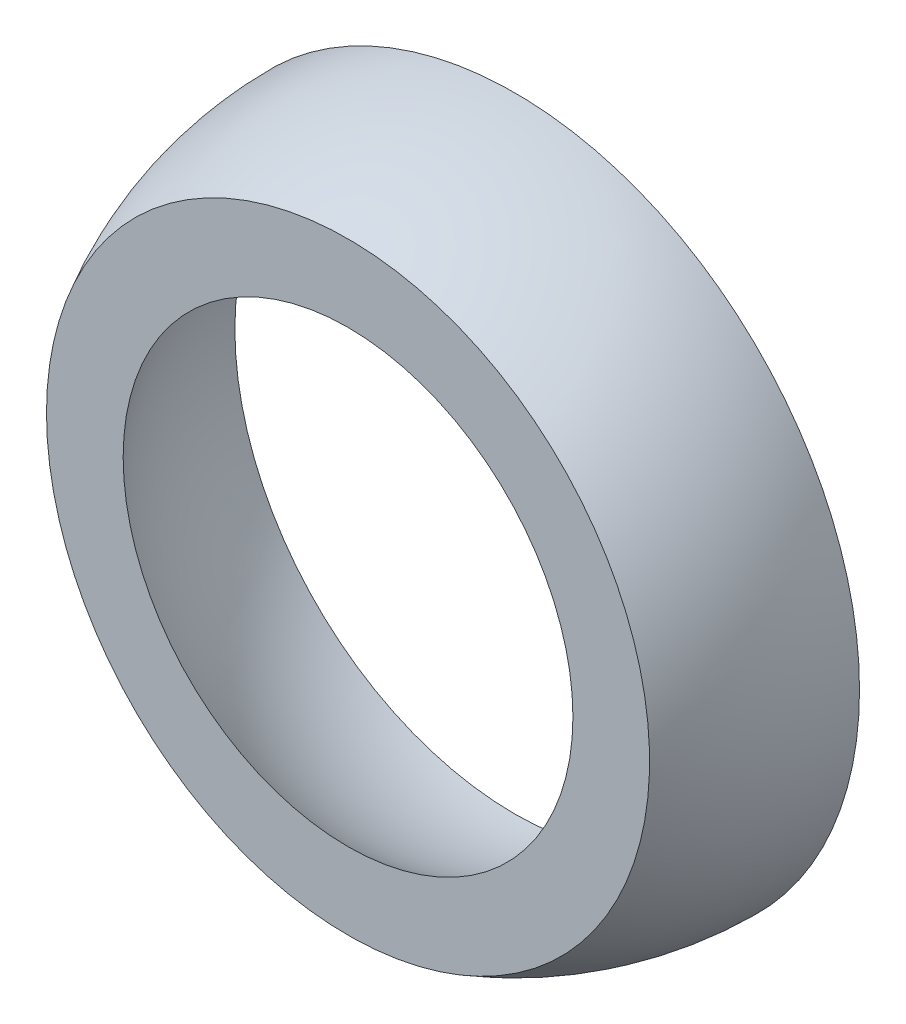
ISO-10303-21;
HEADER;
FILE_DESCRIPTION(('STEP AP214'),'2;1');
FILE_NAME('part.step','',(''),(''),'','','');
FILE_SCHEMA(('AUTOMOTIVE_DESIGN { 1 0 10303 214 1 1 1 1 }'));
ENDSEC;
DATA;
#1=APPLICATION_CONTEXT('core data for automotive mechanical design processes');
#2=APPLICATION_PROTOCOL_DEFINITION('international standard','automotive_design',2000,#1);
#3=PRODUCT_CONTEXT('',#1,'mechanical');
#4=PRODUCT('Part','Part','',(#3));
#5=PRODUCT_RELATED_PRODUCT_CATEGORY('part','',(#4));
#6=PRODUCT_DEFINITION_FORMATION('','',#4);
#7=PRODUCT_DEFINITION_CONTEXT('part definition',#1,'design');
#8=PRODUCT_DEFINITION('design','',#6,#7);
#9=PRODUCT_DEFINITION_SHAPE('','',#8);
#10=(LENGTH_UNIT() NAMED_UNIT(*) SI_UNIT(.MILLI.,.METRE.));
#11=(NAMED_UNIT(*) PLANE_ANGLE_UNIT() SI_UNIT($,.RADIAN.));
#12=(NAMED_UNIT(*) SI_UNIT($,.STERADIAN.) SOLID_ANGLE_UNIT());
#13=UNCERTAINTY_MEASURE_WITH_UNIT(LENGTH_MEASURE(1.E-05),#10,'distance_accuracy_value','');
#14=(GEOMETRIC_REPRESENTATION_CONTEXT(3) GLOBAL_UNCERTAINTY_ASSIGNED_CONTEXT((#13)) GLOBAL_UNIT_ASSIGNED_CONTEXT((#10,
#11,#12)) REPRESENTATION_CONTEXT('',''));
#15=CARTESIAN_POINT('',(0.,0.,0.));
#16=DIRECTION('',(0.,0.,1.));
#17=DIRECTION('',(1.,0.,0.));
#18=AXIS2_PLACEMENT_3D('',#15,#16,#17);
#19=CARTESIAN_POINT('',(0.,0.,0.));
#20=DIRECTION('',(0.,0.,1.));
#21=DIRECTION('',(0.,-1.,0.));
#22=AXIS2_PLACEMENT_3D('',#19,#20,#21);
#23=SPHERICAL_SURFACE('',#22,13.);
#24=CARTESIAN_POINT('',(0.,0.,7.74596669241483));
#25=DIRECTION('',(0.,0.,-1.));
#26=DIRECTION('',(-1.,0.,0.));
#27=AXIS2_PLACEMENT_3D('',#24,#25,#26);
#28=CIRCLE('',#27,10.4403065089106);
#29=CARTESIAN_POINT('',(-10.4403065089106,0.,7.74596669241483));
#30=VERTEX_POINT('',#29);
#31=EDGE_CURVE('E45',#30,#30,#28,.F.);
#32=ORIENTED_EDGE('',*,*,#31,.T.);
#33=EDGE_LOOP('',(#32));
#34=FACE_BOUND('',#33,.T.);
#35=CARTESIAN_POINT('',(0.,0.,0.));
#36=DIRECTION('',(0.,0.,1.));
#37=DIRECTION('',(1.,0.,0.));
#38=AXIS2_PLACEMENT_3D('',#35,#36,#37);
#39=CIRCLE('',#38,13.);
#40=CARTESIAN_POINT('',(13.,0.,0.));
#41=VERTEX_POINT('',#40);
#42=EDGE_CURVE('E37',#41,#41,#39,.T.);
#43=ORIENTED_EDGE('',*,*,#42,.F.);
#44=EDGE_LOOP('',(#43));
#45=FACE_BOUND('',#44,.T.);
#46=ADVANCED_FACE('F31',(#34,#45),#23,.F.);
#47=CARTESIAN_POINT('',(0.,16.,0.));
#48=DIRECTION('',(0.,0.,1.));
#49=DIRECTION('',(1.,0.,0.));
#50=AXIS2_PLACEMENT_3D('',#47,#48,#49);
#51=PLANE('',#50);
#52=CARTESIAN_POINT('',(0.,0.,0.));
#53=DIRECTION('',(0.,0.,1.));
#54=DIRECTION('',(1.,0.,0.));
#55=AXIS2_PLACEMENT_3D('',#52,#53,#54);
#56=CIRCLE('',#55,16.);
#57=CARTESIAN_POINT('',(16.,0.,0.));
#58=VERTEX_POINT('',#57);
#59=EDGE_CURVE('E41',#58,#58,#56,.T.);
#60=ORIENTED_EDGE('',*,*,#59,.F.);
#61=EDGE_LOOP('',(#60));
#62=FACE_BOUND('',#61,.T.);
#63=ORIENTED_EDGE('',*,*,#42,.T.);
#64=EDGE_LOOP('',(#63));
#65=FACE_BOUND('',#64,.T.);
#66=ADVANCED_FACE('F61',(#62,#65),#51,.F.);
#67=CARTESIAN_POINT('',(0.,0.,0.));
#68=DIRECTION('',(0.,0.,1.));
#69=DIRECTION('',(0.,1.,0.));
#70=AXIS2_PLACEMENT_3D('',#67,#68,#69);
#71=SPHERICAL_SURFACE('',#70,16.);
#72=CARTESIAN_POINT('',(0.,0.,7.74596669241483));
#73=DIRECTION('',(0.,0.,-1.));
#74=DIRECTION('',(-1.,0.,0.));
#75=AXIS2_PLACEMENT_3D('',#72,#73,#74);
#76=CIRCLE('',#75,14.);
#77=CARTESIAN_POINT('',(-14.,0.,7.74596669241483));
#78=VERTEX_POINT('',#77);
#79=EDGE_CURVE('E10',#78,#78,#76,.T.);
#80=ORIENTED_EDGE('',*,*,#79,.T.);
#81=EDGE_LOOP('',(#80));
#82=FACE_BOUND('',#81,.T.);
#83=ORIENTED_EDGE('',*,*,#59,.T.);
#84=EDGE_LOOP('',(#83));
#85=FACE_BOUND('',#84,.T.);
#86=ADVANCED_FACE('F55',(#82,#85),#71,.T.);
#87=CARTESIAN_POINT('',(-16.,14.,7.74596669241483));
#88=DIRECTION('',(0.,0.,-1.));
#89=DIRECTION('',(-1.,0.,0.));
#90=AXIS2_PLACEMENT_3D('',#87,#88,#89);
#91=PLANE('',#90);
#92=ORIENTED_EDGE('',*,*,#79,.F.);
#93=EDGE_LOOP('',(#92));
#94=FACE_BOUND('',#93,.T.);
#95=ORIENTED_EDGE('',*,*,#31,.F.);
#96=EDGE_LOOP('',(#95));
#97=FACE_BOUND('',#96,.T.);
#98=ADVANCED_FACE('F53',(#94,#97),#91,.F.);
#99=CLOSED_SHELL('',(#46,#66,#86,#98));
#100=MANIFOLD_SOLID_BREP('B2',#99);
#101=ADVANCED_BREP_SHAPE_REPRESENTATION('',(#18,#100),#14);
#102=SHAPE_DEFINITION_REPRESENTATION(#9,#101);
ENDSEC;
END-ISO-10303-21;
